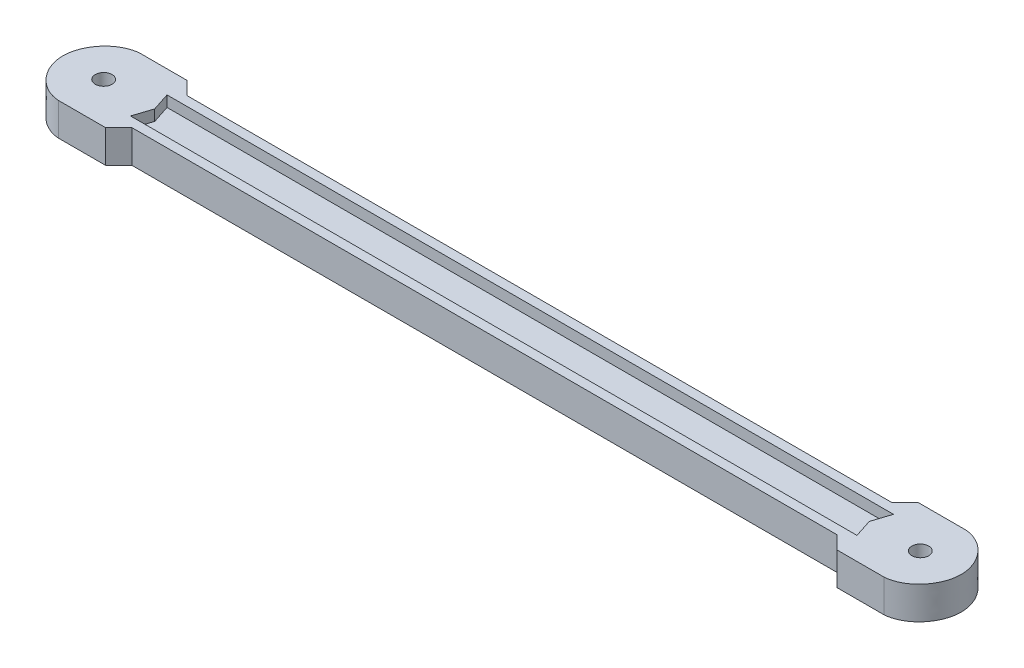
ISO-10303-21;
HEADER;
FILE_DESCRIPTION(('STEP AP214'),'2;1');
FILE_NAME('part.step','',(''),(''),'','','');
FILE_SCHEMA(('AUTOMOTIVE_DESIGN { 1 0 10303 214 1 1 1 1 }'));
ENDSEC;
DATA;
#1=APPLICATION_CONTEXT('core data for automotive mechanical design processes');
#2=APPLICATION_PROTOCOL_DEFINITION('international standard','automotive_design',2000,#1);
#3=PRODUCT_CONTEXT('',#1,'mechanical');
#4=PRODUCT('Part','Part','',(#3));
#5=PRODUCT_RELATED_PRODUCT_CATEGORY('part','',(#4));
#6=PRODUCT_DEFINITION_FORMATION('','',#4);
#7=PRODUCT_DEFINITION_CONTEXT('part definition',#1,'design');
#8=PRODUCT_DEFINITION('design','',#6,#7);
#9=PRODUCT_DEFINITION_SHAPE('','',#8);
#10=(LENGTH_UNIT() NAMED_UNIT(*) SI_UNIT(.MILLI.,.METRE.));
#11=(NAMED_UNIT(*) PLANE_ANGLE_UNIT() SI_UNIT($,.RADIAN.));
#12=(NAMED_UNIT(*) SI_UNIT($,.STERADIAN.) SOLID_ANGLE_UNIT());
#13=UNCERTAINTY_MEASURE_WITH_UNIT(LENGTH_MEASURE(1.E-05),#10,'distance_accuracy_value','');
#14=(GEOMETRIC_REPRESENTATION_CONTEXT(3) GLOBAL_UNCERTAINTY_ASSIGNED_CONTEXT((#13)) GLOBAL_UNIT_ASSIGNED_CONTEXT((#10,
#11,#12)) REPRESENTATION_CONTEXT('',''));
#15=CARTESIAN_POINT('',(0.,0.,0.));
#16=DIRECTION('',(0.,0.,1.));
#17=DIRECTION('',(1.,0.,0.));
#18=AXIS2_PLACEMENT_3D('',#15,#16,#17);
#19=CARTESIAN_POINT('',(-82.5,6.,-7.5));
#20=DIRECTION('',(0.,0.,1.));
#21=DIRECTION('',(1.,0.,0.));
#22=AXIS2_PLACEMENT_3D('',#19,#20,#21);
#23=PLANE('',#22);
#24=DIRECTION('',(0.,1.,0.));
#25=VECTOR('',#24,1.);
#26=CARTESIAN_POINT('',(75.8154783819914,-6.,-7.50000000000003));
#27=LINE('',#26,#25);
#28=CARTESIAN_POINT('',(75.8154783819914,0.,-7.50000000000002));
#29=VERTEX_POINT('',#28);
#30=CARTESIAN_POINT('',(75.8154783819914,6.,-7.50000000000002));
#31=VERTEX_POINT('',#30);
#32=EDGE_CURVE('E269',#29,#31,#27,.T.);
#33=ORIENTED_EDGE('',*,*,#32,.F.);
#34=DIRECTION('',(-1.,0.,0.));
#35=VECTOR('',#34,1.);
#36=CARTESIAN_POINT('',(-82.5,0.,-7.5));
#37=LINE('',#36,#35);
#38=CARTESIAN_POINT('',(67.1591580722005,0.,-7.50000000000003));
#39=VERTEX_POINT('',#38);
#40=EDGE_CURVE('E272',#29,#39,#37,.T.);
#41=ORIENTED_EDGE('',*,*,#40,.T.);
#42=DIRECTION('',(0.,1.,0.));
#43=VECTOR('',#42,1.);
#44=CARTESIAN_POINT('',(67.1591580722005,-6.,-7.50000000000003));
#45=LINE('',#44,#43);
#46=CARTESIAN_POINT('',(67.1591580722005,6.,-7.50000000000003));
#47=VERTEX_POINT('',#46);
#48=EDGE_CURVE('E335',#39,#47,#45,.T.);
#49=ORIENTED_EDGE('',*,*,#48,.T.);
#50=DIRECTION('',(-1.,0.,0.));
#51=VECTOR('',#50,1.);
#52=CARTESIAN_POINT('',(-82.5,6.,-7.5));
#53=LINE('',#52,#51);
#54=EDGE_CURVE('E274',#31,#47,#53,.T.);
#55=ORIENTED_EDGE('',*,*,#54,.F.);
#56=EDGE_LOOP('',(#33,#41,#49,#55));
#57=FACE_BOUND('',#56,.T.);
#58=ADVANCED_FACE('F33',(#57),#23,.F.);
#59=DIRECTION('',(0.,1.,0.));
#60=VECTOR('',#59,1.);
#61=CARTESIAN_POINT('',(-75.8154783819918,-6.,-7.5));
#62=LINE('',#61,#60);
#63=CARTESIAN_POINT('',(-75.8154783819919,6.,-7.5));
#64=VERTEX_POINT('',#63);
#65=CARTESIAN_POINT('',(-75.8154783819919,0.,-7.5));
#66=VERTEX_POINT('',#65);
#67=EDGE_CURVE('E351',#64,#66,#62,.F.);
#68=ORIENTED_EDGE('',*,*,#67,.F.);
#69=CARTESIAN_POINT('',(-67.1591580722005,6.,-7.50000000000003));
#70=VERTEX_POINT('',#69);
#71=EDGE_CURVE('E354',#70,#64,#53,.T.);
#72=ORIENTED_EDGE('',*,*,#71,.F.);
#73=DIRECTION('',(0.,1.,0.));
#74=VECTOR('',#73,1.);
#75=CARTESIAN_POINT('',(-67.1591580722005,-6.,-7.50000000000003));
#76=LINE('',#75,#74);
#77=CARTESIAN_POINT('',(-67.1591580722005,0.,-7.50000000000003));
#78=VERTEX_POINT('',#77);
#79=EDGE_CURVE('E331',#78,#70,#76,.T.);
#80=ORIENTED_EDGE('',*,*,#79,.F.);
#81=EDGE_CURVE('E55',#78,#66,#37,.T.);
#82=ORIENTED_EDGE('',*,*,#81,.T.);
#83=EDGE_LOOP('',(#68,#72,#80,#82));
#84=FACE_BOUND('',#83,.T.);
#85=ADVANCED_FACE('F255',(#84),#23,.F.);
#86=CARTESIAN_POINT('',(-82.5,6.,7.5));
#87=DIRECTION('',(0.,0.,-1.));
#88=DIRECTION('',(-1.,0.,0.));
#89=AXIS2_PLACEMENT_3D('',#86,#87,#88);
#90=PLANE('',#89);
#91=DIRECTION('',(1.,0.,0.));
#92=VECTOR('',#91,1.);
#93=CARTESIAN_POINT('',(-82.5,0.,7.5));
#94=LINE('',#93,#92);
#95=CARTESIAN_POINT('',(67.1591580722005,0.,7.50000000000003));
#96=VERTEX_POINT('',#95);
#97=CARTESIAN_POINT('',(75.8154783799445,0.,7.50000000000003));
#98=VERTEX_POINT('',#97);
#99=EDGE_CURVE('E286',#96,#98,#94,.T.);
#100=ORIENTED_EDGE('',*,*,#99,.T.);
#101=DIRECTION('',(0.,1.,0.));
#102=VECTOR('',#101,1.);
#103=CARTESIAN_POINT('',(75.8154783799444,-6.,7.50000000000003));
#104=LINE('',#103,#102);
#105=CARTESIAN_POINT('',(75.8154783799445,6.,7.50000000000003));
#106=VERTEX_POINT('',#105);
#107=EDGE_CURVE('E277',#106,#98,#104,.F.);
#108=ORIENTED_EDGE('',*,*,#107,.F.);
#109=DIRECTION('',(1.,0.,0.));
#110=VECTOR('',#109,1.);
#111=CARTESIAN_POINT('',(-82.5,6.,7.5));
#112=LINE('',#111,#110);
#113=CARTESIAN_POINT('',(67.1591580722005,6.,7.50000000000003));
#114=VERTEX_POINT('',#113);
#115=EDGE_CURVE('E291',#114,#106,#112,.T.);
#116=ORIENTED_EDGE('',*,*,#115,.F.);
#117=DIRECTION('',(0.,1.,0.));
#118=VECTOR('',#117,1.);
#119=CARTESIAN_POINT('',(67.1591580722005,-6.,7.50000000000003));
#120=LINE('',#119,#118);
#121=EDGE_CURVE('E340',#96,#114,#120,.T.);
#122=ORIENTED_EDGE('',*,*,#121,.F.);
#123=EDGE_LOOP('',(#100,#108,#116,#122));
#124=FACE_BOUND('',#123,.T.);
#125=ADVANCED_FACE('F253',(#124),#90,.F.);
#126=DIRECTION('',(0.,1.,0.));
#127=VECTOR('',#126,1.);
#128=CARTESIAN_POINT('',(-75.8154783799448,-6.,7.5));
#129=LINE('',#128,#127);
#130=CARTESIAN_POINT('',(-75.8154783799449,0.,7.49999999999999));
#131=VERTEX_POINT('',#130);
#132=CARTESIAN_POINT('',(-75.8154783799449,6.,7.5));
#133=VERTEX_POINT('',#132);
#134=EDGE_CURVE('E333',#131,#133,#129,.T.);
#135=ORIENTED_EDGE('',*,*,#134,.F.);
#136=CARTESIAN_POINT('',(-67.1591580722005,0.,7.5));
#137=VERTEX_POINT('',#136);
#138=EDGE_CURVE('E288',#131,#137,#94,.T.);
#139=ORIENTED_EDGE('',*,*,#138,.T.);
#140=DIRECTION('',(0.,1.,0.));
#141=VECTOR('',#140,1.);
#142=CARTESIAN_POINT('',(-67.1591580722005,-6.,7.50000000000003));
#143=LINE('',#142,#141);
#144=CARTESIAN_POINT('',(-67.1591580722005,6.,7.50000000000003));
#145=VERTEX_POINT('',#144);
#146=EDGE_CURVE('E346',#137,#145,#143,.T.);
#147=ORIENTED_EDGE('',*,*,#146,.T.);
#148=EDGE_CURVE('E300',#133,#145,#112,.T.);
#149=ORIENTED_EDGE('',*,*,#148,.F.);
#150=EDGE_LOOP('',(#135,#139,#147,#149));
#151=FACE_BOUND('',#150,.T.);
#152=ADVANCED_FACE('F249',(#151),#90,.F.);
#153=CARTESIAN_POINT('',(0.,6.,0.));
#154=DIRECTION('',(0.,-1.,0.));
#155=DIRECTION('',(0.,0.,-1.));
#156=AXIS2_PLACEMENT_3D('',#153,#154,#155);
#157=PLANE('',#156);
#158=DIRECTION('',(1.,0.,0.));
#159=VECTOR('',#158,1.);
#160=CARTESIAN_POINT('',(-66.7174150880342,6.,3.35193649705162));
#161=LINE('',#160,#159);
#162=CARTESIAN_POINT('',(-66.7174150880342,6.,3.35193649705162));
#163=VERTEX_POINT('',#162);
#164=CARTESIAN_POINT('',(66.7174150880342,6.,3.35193649705162));
#165=VERTEX_POINT('',#164);
#166=EDGE_CURVE('E194',#163,#165,#161,.T.);
#167=ORIENTED_EDGE('',*,*,#166,.F.);
#168=DIRECTION('',(-0.309876944964654,0.,0.950776671453067));
#169=VECTOR('',#168,1.);
#170=CARTESIAN_POINT('',(-65.6249526069823,6.,0.));
#171=LINE('',#170,#169);
#172=CARTESIAN_POINT('',(-65.6249526069823,6.,0.));
#173=VERTEX_POINT('',#172);
#174=EDGE_CURVE('E47',#173,#163,#171,.T.);
#175=ORIENTED_EDGE('',*,*,#174,.F.);
#176=DIRECTION('',(0.309876944964654,0.,0.950776671453067));
#177=VECTOR('',#176,1.);
#178=CARTESIAN_POINT('',(-65.6249526069823,6.,0.));
#179=LINE('',#178,#177);
#180=CARTESIAN_POINT('',(-66.7174150880342,6.,-3.35193649705162));
#181=VERTEX_POINT('',#180);
#182=EDGE_CURVE('E180',#181,#173,#179,.T.);
#183=ORIENTED_EDGE('',*,*,#182,.F.);
#184=DIRECTION('',(-1.,0.,0.));
#185=VECTOR('',#184,1.);
#186=CARTESIAN_POINT('',(-66.7174150880342,6.,-3.35193649705162));
#187=LINE('',#186,#185);
#188=CARTESIAN_POINT('',(66.7174150880342,6.,-3.35193649705162));
#189=VERTEX_POINT('',#188);
#190=EDGE_CURVE('E183',#189,#181,#187,.T.);
#191=ORIENTED_EDGE('',*,*,#190,.F.);
#192=DIRECTION('',(0.309876944964654,0.,-0.950776671453067));
#193=VECTOR('',#192,1.);
#194=CARTESIAN_POINT('',(65.6249526069823,6.,0.));
#195=LINE('',#194,#193);
#196=CARTESIAN_POINT('',(65.6249526069823,6.,0.));
#197=VERTEX_POINT('',#196);
#198=EDGE_CURVE('E199',#197,#189,#195,.T.);
#199=ORIENTED_EDGE('',*,*,#198,.F.);
#200=DIRECTION('',(-0.309876944964654,0.,-0.950776671453067));
#201=VECTOR('',#200,1.);
#202=CARTESIAN_POINT('',(65.6249526069823,6.,0.));
#203=LINE('',#202,#201);
#204=EDGE_CURVE('E196',#165,#197,#203,.T.);
#205=ORIENTED_EDGE('',*,*,#204,.F.);
#206=EDGE_LOOP('',(#167,#175,#183,#191,#199,#205));
#207=FACE_BOUND('',#206,.T.);
#208=CARTESIAN_POINT('',(-75.,6.,0.));
#209=DIRECTION('',(0.,-1.,0.));
#210=DIRECTION('',(0.,0.,-1.));
#211=AXIS2_PLACEMENT_3D('',#208,#209,#210);
#212=CIRCLE('',#211,1.54999999999999);
#213=CARTESIAN_POINT('',(-75.,6.,-1.54999999999999));
#214=VERTEX_POINT('',#213);
#215=EDGE_CURVE('E222',#214,#214,#212,.T.);
#216=ORIENTED_EDGE('',*,*,#215,.T.);
#217=EDGE_LOOP('',(#216));
#218=FACE_BOUND('',#217,.T.);
#219=CARTESIAN_POINT('',(75.,6.,0.));
#220=DIRECTION('',(0.,-1.,0.));
#221=DIRECTION('',(0.,0.,-1.));
#222=AXIS2_PLACEMENT_3D('',#219,#220,#221);
#223=CIRCLE('',#222,1.54999999999999);
#224=CARTESIAN_POINT('',(75.,6.,-1.54999999999999));
#225=VERTEX_POINT('',#224);
#226=EDGE_CURVE('E217',#225,#225,#223,.T.);
#227=ORIENTED_EDGE('',*,*,#226,.T.);
#228=EDGE_LOOP('',(#227));
#229=FACE_BOUND('',#228,.T.);
#230=DIRECTION('',(-0.707106781186552,0.,-0.707106781186543));
#231=VECTOR('',#230,1.);
#232=CARTESIAN_POINT('',(-67.1591580722005,6.,-7.50000000000003));
#233=LINE('',#232,#231);
#234=CARTESIAN_POINT('',(-64.7385162336034,6.,-5.07935816140295));
#235=VERTEX_POINT('',#234);
#236=EDGE_CURVE('E329',#235,#70,#233,.T.);
#237=ORIENTED_EDGE('',*,*,#236,.T.);
#238=ORIENTED_EDGE('',*,*,#71,.T.);
#239=CARTESIAN_POINT('',(-75.,6.,-7.50000000000003));
#240=CARTESIAN_POINT('',(-79.0851812404319,6.,-7.77395705413379));
#241=CARTESIAN_POINT('',(-85.9148187585371,6.,8.00597869860029E-10));
#242=CARTESIAN_POINT('',(-79.0851812424938,6.,7.77395705319478));
#243=CARTESIAN_POINT('',(-75.,6.,7.50000000000002));
#244=B_SPLINE_CURVE_WITH_KNOTS('',3,(#239,#240,#241,#242,#243),.UNSPECIFIED.,.F.,.F.,(4,1,4),
(0.,0.499999999989352,1.),.UNSPECIFIED.);
#245=EDGE_CURVE('E225',#64,#133,#244,.T.);
#246=ORIENTED_EDGE('',*,*,#245,.T.);
#247=ORIENTED_EDGE('',*,*,#148,.T.);
#248=DIRECTION('',(0.707106781186552,0.,-0.707106781186543));
#249=VECTOR('',#248,1.);
#250=CARTESIAN_POINT('',(-67.1591580722005,6.,7.50000000000003));
#251=LINE('',#250,#249);
#252=CARTESIAN_POINT('',(-64.7385162336034,6.,5.07935816140295));
#253=VERTEX_POINT('',#252);
#254=EDGE_CURVE('E366',#145,#253,#251,.T.);
#255=ORIENTED_EDGE('',*,*,#254,.T.);
#256=DIRECTION('',(1.,0.,0.));
#257=VECTOR('',#256,1.);
#258=CARTESIAN_POINT('',(-64.7385162336034,6.,5.07935816140295));
#259=LINE('',#258,#257);
#260=CARTESIAN_POINT('',(64.7385162336034,6.,5.07935816140295));
#261=VERTEX_POINT('',#260);
#262=EDGE_CURVE('E380',#253,#261,#259,.T.);
#263=ORIENTED_EDGE('',*,*,#262,.T.);
#264=DIRECTION('',(0.707106781186552,0.,0.707106781186543));
#265=VECTOR('',#264,1.);
#266=CARTESIAN_POINT('',(67.1591580722005,6.,7.50000000000003));
#267=LINE('',#266,#265);
#268=EDGE_CURVE('E376',#261,#114,#267,.T.);
#269=ORIENTED_EDGE('',*,*,#268,.T.);
#270=ORIENTED_EDGE('',*,*,#115,.T.);
#271=CARTESIAN_POINT('',(75.,6.,7.50000000000002));
#272=CARTESIAN_POINT('',(79.0851812424938,6.,7.77395705319478));
#273=CARTESIAN_POINT('',(85.9148187585372,6.,8.00598006368919E-10));
#274=CARTESIAN_POINT('',(79.0851812404319,6.,-7.77395705413379));
#275=CARTESIAN_POINT('',(75.,6.,-7.50000000000003));
#276=B_SPLINE_CURVE_WITH_KNOTS('',3,(#271,#272,#273,#274,#275),.UNSPECIFIED.,.F.,.F.,(4,1,4),
(0.,0.500000000010648,1.),.UNSPECIFIED.);
#277=EDGE_CURVE('E379',#106,#31,#276,.T.);
#278=ORIENTED_EDGE('',*,*,#277,.T.);
#279=ORIENTED_EDGE('',*,*,#54,.T.);
#280=DIRECTION('',(-0.707106781186552,0.,0.707106781186543));
#281=VECTOR('',#280,1.);
#282=CARTESIAN_POINT('',(67.1591580722005,6.,-7.50000000000003));
#283=LINE('',#282,#281);
#284=CARTESIAN_POINT('',(64.7385162336034,6.,-5.07935816140295));
#285=VERTEX_POINT('',#284);
#286=EDGE_CURVE('E388',#47,#285,#283,.T.);
#287=ORIENTED_EDGE('',*,*,#286,.T.);
#288=DIRECTION('',(-1.,0.,0.));
#289=VECTOR('',#288,1.);
#290=CARTESIAN_POINT('',(-64.7385162336034,6.,-5.07935816140295));
#291=LINE('',#290,#289);
#292=EDGE_CURVE('E394',#285,#235,#291,.T.);
#293=ORIENTED_EDGE('',*,*,#292,.T.);
#294=EDGE_LOOP('',(#237,#238,#246,#247,#255,#263,#269,#270,#278,#279,#287,#293));
#295=FACE_BOUND('',#294,.T.);
#296=ADVANCED_FACE('F246',(#207,#218,#229,#295),#157,.F.);
#297=CARTESIAN_POINT('',(0.,0.,0.));
#298=DIRECTION('',(0.,-1.,0.));
#299=DIRECTION('',(0.,0.,-1.));
#300=AXIS2_PLACEMENT_3D('',#297,#298,#299);
#301=PLANE('',#300);
#302=CARTESIAN_POINT('',(-75.,0.,0.));
#303=DIRECTION('',(0.,-1.,0.));
#304=DIRECTION('',(0.,0.,-1.));
#305=AXIS2_PLACEMENT_3D('',#302,#303,#304);
#306=CIRCLE('',#305,1.54999999999999);
#307=CARTESIAN_POINT('',(-75.,0.,-1.54999999999999));
#308=VERTEX_POINT('',#307);
#309=EDGE_CURVE('E214',#308,#308,#306,.T.);
#310=ORIENTED_EDGE('',*,*,#309,.F.);
#311=EDGE_LOOP('',(#310));
#312=FACE_BOUND('',#311,.T.);
#313=CARTESIAN_POINT('',(75.,0.,0.));
#314=DIRECTION('',(0.,-1.,0.));
#315=DIRECTION('',(0.,0.,1.));
#316=AXIS2_PLACEMENT_3D('',#313,#314,#315);
#317=CIRCLE('',#316,1.54999999999999);
#318=CARTESIAN_POINT('',(75.,0.,1.54999999999999));
#319=VERTEX_POINT('',#318);
#320=EDGE_CURVE('E206',#319,#319,#317,.T.);
#321=ORIENTED_EDGE('',*,*,#320,.F.);
#322=EDGE_LOOP('',(#321));
#323=FACE_BOUND('',#322,.T.);
#324=ORIENTED_EDGE('',*,*,#81,.F.);
#325=DIRECTION('',(0.707106781186552,0.,0.707106781186543));
#326=VECTOR('',#325,1.);
#327=CARTESIAN_POINT('',(-29.8295790360998,0.,29.8295790361002));
#328=LINE('',#327,#326);
#329=CARTESIAN_POINT('',(-64.7385162336034,0.,-5.07935816140295));
#330=VERTEX_POINT('',#329);
#331=EDGE_CURVE('E11',#78,#330,#328,.T.);
#332=ORIENTED_EDGE('',*,*,#331,.T.);
#333=DIRECTION('',(1.,0.,0.));
#334=VECTOR('',#333,1.);
#335=CARTESIAN_POINT('',(0.,0.,-5.07935816140295));
#336=LINE('',#335,#334);
#337=CARTESIAN_POINT('',(64.7385162336034,0.,-5.07935816140295));
#338=VERTEX_POINT('',#337);
#339=EDGE_CURVE('E40',#330,#338,#336,.T.);
#340=ORIENTED_EDGE('',*,*,#339,.T.);
#341=DIRECTION('',(0.707106781186552,0.,-0.707106781186543));
#342=VECTOR('',#341,1.);
#343=CARTESIAN_POINT('',(29.8295790360998,0.,29.8295790361002));
#344=LINE('',#343,#342);
#345=EDGE_CURVE('E285',#338,#39,#344,.T.);
#346=ORIENTED_EDGE('',*,*,#345,.T.);
#347=ORIENTED_EDGE('',*,*,#40,.F.);
#348=CARTESIAN_POINT('',(75.,0.,7.50000000000002));
#349=CARTESIAN_POINT('',(79.0851812424938,0.,7.77395705319478));
#350=CARTESIAN_POINT('',(85.9148187585372,0.,8.00598006368919E-10));
#351=CARTESIAN_POINT('',(79.0851812404319,0.,-7.77395705413379));
#352=CARTESIAN_POINT('',(75.,0.,-7.50000000000003));
#353=B_SPLINE_CURVE_WITH_KNOTS('',3,(#348,#349,#350,#351,#352),.UNSPECIFIED.,.F.,.F.,(4,1,4),
(0.,0.500000000010648,1.),.UNSPECIFIED.);
#354=EDGE_CURVE('E283',#29,#98,#353,.F.);
#355=ORIENTED_EDGE('',*,*,#354,.T.);
#356=ORIENTED_EDGE('',*,*,#99,.F.);
#357=DIRECTION('',(-0.707106781186552,0.,-0.707106781186543));
#358=VECTOR('',#357,1.);
#359=CARTESIAN_POINT('',(29.8295790360998,0.,-29.8295790361002));
#360=LINE('',#359,#358);
#361=CARTESIAN_POINT('',(64.7385162336034,0.,5.07935816140295));
#362=VERTEX_POINT('',#361);
#363=EDGE_CURVE('E309',#96,#362,#360,.T.);
#364=ORIENTED_EDGE('',*,*,#363,.T.);
#365=DIRECTION('',(-1.,0.,0.));
#366=VECTOR('',#365,1.);
#367=CARTESIAN_POINT('',(0.,0.,5.07935816140295));
#368=LINE('',#367,#366);
#369=CARTESIAN_POINT('',(-64.7385162336034,0.,5.07935816140295));
#370=VERTEX_POINT('',#369);
#371=EDGE_CURVE('E306',#362,#370,#368,.T.);
#372=ORIENTED_EDGE('',*,*,#371,.T.);
#373=DIRECTION('',(-0.707106781186552,0.,0.707106781186543));
#374=VECTOR('',#373,1.);
#375=CARTESIAN_POINT('',(-29.8295790360998,0.,-29.8295790361002));
#376=LINE('',#375,#374);
#377=EDGE_CURVE('E299',#370,#137,#376,.T.);
#378=ORIENTED_EDGE('',*,*,#377,.T.);
#379=ORIENTED_EDGE('',*,*,#138,.F.);
#380=CARTESIAN_POINT('',(-75.,0.,-7.50000000000003));
#381=CARTESIAN_POINT('',(-79.0851812404319,0.,-7.77395705413379));
#382=CARTESIAN_POINT('',(-85.9148187585371,0.,8.00597869860029E-10));
#383=CARTESIAN_POINT('',(-79.0851812424938,0.,7.77395705319478));
#384=CARTESIAN_POINT('',(-75.,0.,7.50000000000002));
#385=B_SPLINE_CURVE_WITH_KNOTS('',3,(#380,#381,#382,#383,#384),.UNSPECIFIED.,.F.,.F.,(4,1,4),
(0.,0.499999999989352,1.),.UNSPECIFIED.);
#386=EDGE_CURVE('E294',#131,#66,#385,.F.);
#387=ORIENTED_EDGE('',*,*,#386,.T.);
#388=EDGE_LOOP('',(#324,#332,#340,#346,#347,#355,#356,#364,#372,#378,#379,#387));
#389=FACE_BOUND('',#388,.T.);
#390=ADVANCED_FACE('F243',(#312,#323,#389),#301,.T.);
#391=CARTESIAN_POINT('',(-75.,-6.,-7.50000000000003));
#392=CARTESIAN_POINT('',(-79.0851812404319,-6.,-7.77395705413379));
#393=CARTESIAN_POINT('',(-85.9148187585371,-6.,8.00597869860029E-10));
#394=CARTESIAN_POINT('',(-79.0851812424938,-6.,7.77395705319478));
#395=CARTESIAN_POINT('',(-75.,-6.,7.50000000000002));
#396=B_SPLINE_CURVE_WITH_KNOTS('',3,(#391,#392,#393,#394,#395),.UNSPECIFIED.,.F.,.F.,(4,1,4),
(0.,0.499999999989352,1.),.UNSPECIFIED.);
#397=DIRECTION('',(0.,1.,0.));
#398=VECTOR('',#397,1.);
#399=SURFACE_OF_LINEAR_EXTRUSION('',#396,#398);
#400=ORIENTED_EDGE('',*,*,#386,.F.);
#401=ORIENTED_EDGE('',*,*,#134,.T.);
#402=ORIENTED_EDGE('',*,*,#245,.F.);
#403=ORIENTED_EDGE('',*,*,#67,.T.);
#404=EDGE_LOOP('',(#400,#401,#402,#403));
#405=FACE_BOUND('',#404,.T.);
#406=ADVANCED_FACE('F238',(#405),#399,.T.);
#407=CARTESIAN_POINT('',(-67.1591580722005,-6.,7.50000000000003));
#408=DIRECTION('',(0.707106781186543,0.,0.707106781186552));
#409=DIRECTION('',(0.707106781186552,0.,-0.707106781186543));
#410=AXIS2_PLACEMENT_3D('',#407,#408,#409);
#411=PLANE('',#410);
#412=DIRECTION('',(0.,1.,0.));
#413=VECTOR('',#412,1.);
#414=CARTESIAN_POINT('',(-64.7385162336034,-6.,5.07935816140295));
#415=LINE('',#414,#413);
#416=EDGE_CURVE('E344',#370,#253,#415,.T.);
#417=ORIENTED_EDGE('',*,*,#416,.T.);
#418=ORIENTED_EDGE('',*,*,#254,.F.);
#419=ORIENTED_EDGE('',*,*,#146,.F.);
#420=ORIENTED_EDGE('',*,*,#377,.F.);
#421=EDGE_LOOP('',(#417,#418,#419,#420));
#422=FACE_BOUND('',#421,.T.);
#423=ADVANCED_FACE('F242',(#422),#411,.T.);
#424=CARTESIAN_POINT('',(-64.7385162336034,-6.,5.07935816140295));
#425=DIRECTION('',(0.,0.,1.));
#426=DIRECTION('',(1.,0.,0.));
#427=AXIS2_PLACEMENT_3D('',#424,#425,#426);
#428=PLANE('',#427);
#429=DIRECTION('',(0.,1.,0.));
#430=VECTOR('',#429,1.);
#431=CARTESIAN_POINT('',(64.7385162336034,-6.,5.07935816140295));
#432=LINE('',#431,#430);
#433=EDGE_CURVE('E342',#362,#261,#432,.T.);
#434=ORIENTED_EDGE('',*,*,#433,.T.);
#435=ORIENTED_EDGE('',*,*,#262,.F.);
#436=ORIENTED_EDGE('',*,*,#416,.F.);
#437=ORIENTED_EDGE('',*,*,#371,.F.);
#438=EDGE_LOOP('',(#434,#435,#436,#437));
#439=FACE_BOUND('',#438,.T.);
#440=ADVANCED_FACE('F369',(#439),#428,.T.);
#441=CARTESIAN_POINT('',(67.1591580722005,-6.,7.50000000000003));
#442=DIRECTION('',(-0.707106781186543,0.,0.707106781186552));
#443=DIRECTION('',(0.707106781186552,0.,0.707106781186543));
#444=AXIS2_PLACEMENT_3D('',#441,#442,#443);
#445=PLANE('',#444);
#446=ORIENTED_EDGE('',*,*,#121,.T.);
#447=ORIENTED_EDGE('',*,*,#268,.F.);
#448=ORIENTED_EDGE('',*,*,#433,.F.);
#449=ORIENTED_EDGE('',*,*,#363,.F.);
#450=EDGE_LOOP('',(#446,#447,#448,#449));
#451=FACE_BOUND('',#450,.T.);
#452=ADVANCED_FACE('F373',(#451),#445,.T.);
#453=CARTESIAN_POINT('',(75.,-6.,7.50000000000002));
#454=CARTESIAN_POINT('',(79.0851812424938,-6.,7.77395705319478));
#455=CARTESIAN_POINT('',(85.9148187585372,-6.,8.00598006368919E-10));
#456=CARTESIAN_POINT('',(79.0851812404319,-6.,-7.77395705413379));
#457=CARTESIAN_POINT('',(75.,-6.,-7.50000000000003));
#458=B_SPLINE_CURVE_WITH_KNOTS('',3,(#453,#454,#455,#456,#457),.UNSPECIFIED.,.F.,.F.,(4,1,4),
(0.,0.500000000010648,1.),.UNSPECIFIED.);
#459=DIRECTION('',(0.,1.,0.));
#460=VECTOR('',#459,1.);
#461=SURFACE_OF_LINEAR_EXTRUSION('',#458,#460);
#462=ORIENTED_EDGE('',*,*,#354,.F.);
#463=ORIENTED_EDGE('',*,*,#32,.T.);
#464=ORIENTED_EDGE('',*,*,#277,.F.);
#465=ORIENTED_EDGE('',*,*,#107,.T.);
#466=EDGE_LOOP('',(#462,#463,#464,#465));
#467=FACE_BOUND('',#466,.T.);
#468=ADVANCED_FACE('F401',(#467),#461,.T.);
#469=CARTESIAN_POINT('',(-67.1591580722005,-6.,-7.50000000000003));
#470=DIRECTION('',(0.707106781186543,0.,-0.707106781186552));
#471=DIRECTION('',(-0.707106781186552,0.,-0.707106781186543));
#472=AXIS2_PLACEMENT_3D('',#469,#470,#471);
#473=PLANE('',#472);
#474=ORIENTED_EDGE('',*,*,#79,.T.);
#475=ORIENTED_EDGE('',*,*,#236,.F.);
#476=DIRECTION('',(0.,1.,0.));
#477=VECTOR('',#476,1.);
#478=CARTESIAN_POINT('',(-64.7385162336034,-6.,-5.07935816140295));
#479=LINE('',#478,#477);
#480=EDGE_CURVE('E323',#330,#235,#479,.T.);
#481=ORIENTED_EDGE('',*,*,#480,.F.);
#482=ORIENTED_EDGE('',*,*,#331,.F.);
#483=EDGE_LOOP('',(#474,#475,#481,#482));
#484=FACE_BOUND('',#483,.T.);
#485=ADVANCED_FACE('F327',(#484),#473,.T.);
#486=CARTESIAN_POINT('',(-64.7385162336034,-6.,-5.07935816140295));
#487=DIRECTION('',(0.,0.,-1.));
#488=DIRECTION('',(-1.,0.,0.));
#489=AXIS2_PLACEMENT_3D('',#486,#487,#488);
#490=PLANE('',#489);
#491=ORIENTED_EDGE('',*,*,#480,.T.);
#492=ORIENTED_EDGE('',*,*,#292,.F.);
#493=DIRECTION('',(0.,1.,0.));
#494=VECTOR('',#493,1.);
#495=CARTESIAN_POINT('',(64.7385162336034,-6.,-5.07935816140295));
#496=LINE('',#495,#494);
#497=EDGE_CURVE('E325',#338,#285,#496,.T.);
#498=ORIENTED_EDGE('',*,*,#497,.F.);
#499=ORIENTED_EDGE('',*,*,#339,.F.);
#500=EDGE_LOOP('',(#491,#492,#498,#499));
#501=FACE_BOUND('',#500,.T.);
#502=ADVANCED_FACE('F321',(#501),#490,.T.);
#503=CARTESIAN_POINT('',(67.1591580722005,-6.,-7.50000000000003));
#504=DIRECTION('',(-0.707106781186543,0.,-0.707106781186552));
#505=DIRECTION('',(-0.707106781186552,0.,0.707106781186543));
#506=AXIS2_PLACEMENT_3D('',#503,#504,#505);
#507=PLANE('',#506);
#508=ORIENTED_EDGE('',*,*,#497,.T.);
#509=ORIENTED_EDGE('',*,*,#286,.F.);
#510=ORIENTED_EDGE('',*,*,#48,.F.);
#511=ORIENTED_EDGE('',*,*,#345,.F.);
#512=EDGE_LOOP('',(#508,#509,#510,#511));
#513=FACE_BOUND('',#512,.T.);
#514=ADVANCED_FACE('F411',(#513),#507,.T.);
#515=CARTESIAN_POINT('',(75.,12.,0.));
#516=DIRECTION('',(0.,-1.,0.));
#517=DIRECTION('',(0.,0.,-1.));
#518=AXIS2_PLACEMENT_3D('',#515,#516,#517);
#519=CYLINDRICAL_SURFACE('',#518,1.54999999999999);
#520=ORIENTED_EDGE('',*,*,#320,.T.);
#521=EDGE_LOOP('',(#520));
#522=FACE_BOUND('',#521,.T.);
#523=ORIENTED_EDGE('',*,*,#226,.F.);
#524=EDGE_LOOP('',(#523));
#525=FACE_BOUND('',#524,.T.);
#526=ADVANCED_FACE('F490',(#522,#525),#519,.F.);
#527=CARTESIAN_POINT('',(-75.,12.,0.));
#528=DIRECTION('',(0.,-1.,0.));
#529=DIRECTION('',(0.,0.,-1.));
#530=AXIS2_PLACEMENT_3D('',#527,#528,#529);
#531=CYLINDRICAL_SURFACE('',#530,1.54999999999999);
#532=ORIENTED_EDGE('',*,*,#309,.T.);
#533=EDGE_LOOP('',(#532));
#534=FACE_BOUND('',#533,.T.);
#535=ORIENTED_EDGE('',*,*,#215,.F.);
#536=EDGE_LOOP('',(#535));
#537=FACE_BOUND('',#536,.T.);
#538=ADVANCED_FACE('F497',(#534,#537),#531,.F.);
#539=CARTESIAN_POINT('',(-65.6249526069823,4.,0.));
#540=DIRECTION('',(-0.950776671453067,0.,-0.309876944964654));
#541=DIRECTION('',(-0.309876944964654,0.,0.950776671453067));
#542=AXIS2_PLACEMENT_3D('',#539,#540,#541);
#543=PLANE('',#542);
#544=ORIENTED_EDGE('',*,*,#174,.T.);
#545=DIRECTION('',(0.,1.,0.));
#546=VECTOR('',#545,1.);
#547=CARTESIAN_POINT('',(-66.7174150880342,4.,3.35193649705162));
#548=LINE('',#547,#546);
#549=CARTESIAN_POINT('',(-66.7174150880342,4.,3.35193649705162));
#550=VERTEX_POINT('',#549);
#551=EDGE_CURVE('E157',#550,#163,#548,.T.);
#552=ORIENTED_EDGE('',*,*,#551,.F.);
#553=DIRECTION('',(-0.309876944964654,0.,0.950776671453067));
#554=VECTOR('',#553,1.);
#555=CARTESIAN_POINT('',(-65.6249526069823,4.,0.));
#556=LINE('',#555,#554);
#557=CARTESIAN_POINT('',(-65.6249526069823,4.,0.));
#558=VERTEX_POINT('',#557);
#559=EDGE_CURVE('E161',#558,#550,#556,.T.);
#560=ORIENTED_EDGE('',*,*,#559,.F.);
#561=DIRECTION('',(0.,1.,0.));
#562=VECTOR('',#561,1.);
#563=CARTESIAN_POINT('',(-65.6249526069823,4.,0.));
#564=LINE('',#563,#562);
#565=EDGE_CURVE('E204',#558,#173,#564,.T.);
#566=ORIENTED_EDGE('',*,*,#565,.T.);
#567=EDGE_LOOP('',(#544,#552,#560,#566));
#568=FACE_BOUND('',#567,.T.);
#569=ADVANCED_FACE('F159',(#568),#543,.F.);
#570=CARTESIAN_POINT('',(-65.6249526069823,4.,0.));
#571=DIRECTION('',(-0.950776671453067,0.,0.309876944964654));
#572=DIRECTION('',(0.309876944964654,0.,0.950776671453067));
#573=AXIS2_PLACEMENT_3D('',#570,#571,#572);
#574=PLANE('',#573);
#575=ORIENTED_EDGE('',*,*,#182,.T.);
#576=ORIENTED_EDGE('',*,*,#565,.F.);
#577=DIRECTION('',(0.309876944964654,0.,0.950776671453067));
#578=VECTOR('',#577,1.);
#579=CARTESIAN_POINT('',(-65.6249526069823,4.,0.));
#580=LINE('',#579,#578);
#581=CARTESIAN_POINT('',(-66.7174150880342,4.,-3.35193649705162));
#582=VERTEX_POINT('',#581);
#583=EDGE_CURVE('E167',#582,#558,#580,.T.);
#584=ORIENTED_EDGE('',*,*,#583,.F.);
#585=DIRECTION('',(0.,1.,0.));
#586=VECTOR('',#585,1.);
#587=CARTESIAN_POINT('',(-66.7174150880342,4.,-3.35193649705162));
#588=LINE('',#587,#586);
#589=EDGE_CURVE('E207',#582,#181,#588,.T.);
#590=ORIENTED_EDGE('',*,*,#589,.T.);
#591=EDGE_LOOP('',(#575,#576,#584,#590));
#592=FACE_BOUND('',#591,.T.);
#593=ADVANCED_FACE('F512',(#592),#574,.F.);
#594=CARTESIAN_POINT('',(-66.7174150880342,4.,-3.35193649705162));
#595=DIRECTION('',(0.,0.,-1.));
#596=DIRECTION('',(-1.,0.,0.));
#597=AXIS2_PLACEMENT_3D('',#594,#595,#596);
#598=PLANE('',#597);
#599=ORIENTED_EDGE('',*,*,#190,.T.);
#600=ORIENTED_EDGE('',*,*,#589,.F.);
#601=DIRECTION('',(-1.,0.,0.));
#602=VECTOR('',#601,1.);
#603=CARTESIAN_POINT('',(-66.7174150880342,4.,-3.35193649705162));
#604=LINE('',#603,#602);
#605=CARTESIAN_POINT('',(66.7174150880342,4.,-3.35193649705162));
#606=VERTEX_POINT('',#605);
#607=EDGE_CURVE('E190',#606,#582,#604,.T.);
#608=ORIENTED_EDGE('',*,*,#607,.F.);
#609=DIRECTION('',(0.,1.,0.));
#610=VECTOR('',#609,1.);
#611=CARTESIAN_POINT('',(66.7174150880342,4.,-3.35193649705162));
#612=LINE('',#611,#610);
#613=EDGE_CURVE('E209',#606,#189,#612,.T.);
#614=ORIENTED_EDGE('',*,*,#613,.T.);
#615=EDGE_LOOP('',(#599,#600,#608,#614));
#616=FACE_BOUND('',#615,.T.);
#617=ADVANCED_FACE('F520',(#616),#598,.F.);
#618=CARTESIAN_POINT('',(65.6249526069823,4.,0.));
#619=DIRECTION('',(0.950776671453067,0.,0.309876944964654));
#620=DIRECTION('',(0.309876944964654,0.,-0.950776671453067));
#621=AXIS2_PLACEMENT_3D('',#618,#619,#620);
#622=PLANE('',#621);
#623=ORIENTED_EDGE('',*,*,#198,.T.);
#624=ORIENTED_EDGE('',*,*,#613,.F.);
#625=DIRECTION('',(0.309876944964654,0.,-0.950776671453067));
#626=VECTOR('',#625,1.);
#627=CARTESIAN_POINT('',(65.6249526069823,4.,0.));
#628=LINE('',#627,#626);
#629=CARTESIAN_POINT('',(65.6249526069823,4.,0.));
#630=VERTEX_POINT('',#629);
#631=EDGE_CURVE('E187',#630,#606,#628,.T.);
#632=ORIENTED_EDGE('',*,*,#631,.F.);
#633=DIRECTION('',(0.,1.,0.));
#634=VECTOR('',#633,1.);
#635=CARTESIAN_POINT('',(65.6249526069823,4.,0.));
#636=LINE('',#635,#634);
#637=EDGE_CURVE('E211',#630,#197,#636,.T.);
#638=ORIENTED_EDGE('',*,*,#637,.T.);
#639=EDGE_LOOP('',(#623,#624,#632,#638));
#640=FACE_BOUND('',#639,.T.);
#641=ADVANCED_FACE('F529',(#640),#622,.F.);
#642=CARTESIAN_POINT('',(65.6249526069823,4.,0.));
#643=DIRECTION('',(0.950776671453067,0.,-0.309876944964654));
#644=DIRECTION('',(-0.309876944964654,0.,-0.950776671453067));
#645=AXIS2_PLACEMENT_3D('',#642,#643,#644);
#646=PLANE('',#645);
#647=ORIENTED_EDGE('',*,*,#204,.T.);
#648=ORIENTED_EDGE('',*,*,#637,.F.);
#649=DIRECTION('',(-0.309876944964654,0.,-0.950776671453067));
#650=VECTOR('',#649,1.);
#651=CARTESIAN_POINT('',(65.6249526069823,4.,0.));
#652=LINE('',#651,#650);
#653=CARTESIAN_POINT('',(66.7174150880342,4.,3.35193649705162));
#654=VERTEX_POINT('',#653);
#655=EDGE_CURVE('E175',#654,#630,#652,.T.);
#656=ORIENTED_EDGE('',*,*,#655,.F.);
#657=DIRECTION('',(0.,1.,0.));
#658=VECTOR('',#657,1.);
#659=CARTESIAN_POINT('',(66.7174150880342,4.,3.35193649705162));
#660=LINE('',#659,#658);
#661=EDGE_CURVE('E166',#654,#165,#660,.T.);
#662=ORIENTED_EDGE('',*,*,#661,.T.);
#663=EDGE_LOOP('',(#647,#648,#656,#662));
#664=FACE_BOUND('',#663,.T.);
#665=ADVANCED_FACE('F538',(#664),#646,.F.);
#666=CARTESIAN_POINT('',(-66.7174150880342,4.,3.35193649705162));
#667=DIRECTION('',(0.,0.,1.));
#668=DIRECTION('',(1.,0.,0.));
#669=AXIS2_PLACEMENT_3D('',#666,#667,#668);
#670=PLANE('',#669);
#671=ORIENTED_EDGE('',*,*,#166,.T.);
#672=ORIENTED_EDGE('',*,*,#661,.F.);
#673=DIRECTION('',(1.,0.,0.));
#674=VECTOR('',#673,1.);
#675=CARTESIAN_POINT('',(-66.7174150880342,4.,3.35193649705162));
#676=LINE('',#675,#674);
#677=EDGE_CURVE('E170',#550,#654,#676,.T.);
#678=ORIENTED_EDGE('',*,*,#677,.F.);
#679=ORIENTED_EDGE('',*,*,#551,.T.);
#680=EDGE_LOOP('',(#671,#672,#678,#679));
#681=FACE_BOUND('',#680,.T.);
#682=ADVANCED_FACE('F171',(#681),#670,.F.);
#683=CARTESIAN_POINT('',(0.,4.,0.));
#684=DIRECTION('',(0.,1.,0.));
#685=DIRECTION('',(0.,0.,1.));
#686=AXIS2_PLACEMENT_3D('',#683,#684,#685);
#687=PLANE('',#686);
#688=ORIENTED_EDGE('',*,*,#559,.T.);
#689=ORIENTED_EDGE('',*,*,#677,.T.);
#690=ORIENTED_EDGE('',*,*,#655,.T.);
#691=ORIENTED_EDGE('',*,*,#631,.T.);
#692=ORIENTED_EDGE('',*,*,#607,.T.);
#693=ORIENTED_EDGE('',*,*,#583,.T.);
#694=EDGE_LOOP('',(#688,#689,#690,#691,#692,#693));
#695=FACE_BOUND('',#694,.T.);
#696=ADVANCED_FACE('F177',(#695),#687,.T.);
#697=CLOSED_SHELL('',(#58,#85,#125,#152,#296,#390,#406,#423,#440,#452,#468,#485,#502,#514,#526,
#538,#569,#593,#617,#641,#665,#682,#696));
#698=MANIFOLD_SOLID_BREP('B2',#697);
#699=ADVANCED_BREP_SHAPE_REPRESENTATION('',(#18,#698),#14);
#700=SHAPE_DEFINITION_REPRESENTATION(#9,#699);
ENDSEC;
END-ISO-10303-21;
